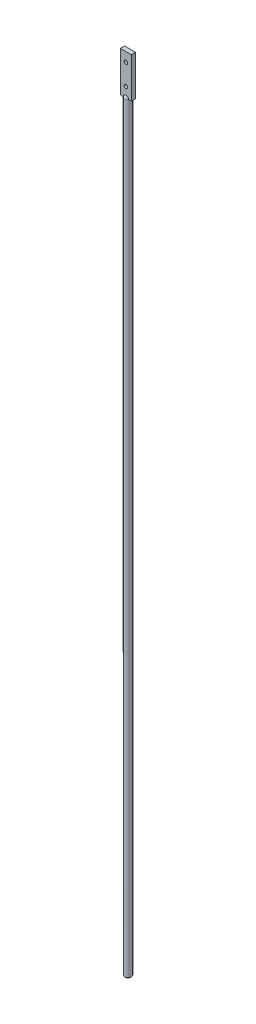
ISO-10303-21;
HEADER;
FILE_DESCRIPTION(('STEP AP214'),'2;1');
FILE_NAME('part.step','',(''),(''),'','','');
FILE_SCHEMA(('AUTOMOTIVE_DESIGN { 1 0 10303 214 1 1 1 1 }'));
ENDSEC;
DATA;
#1=APPLICATION_CONTEXT('core data for automotive mechanical design processes');
#2=APPLICATION_PROTOCOL_DEFINITION('international standard','automotive_design',2000,#1);
#3=PRODUCT_CONTEXT('',#1,'mechanical');
#4=PRODUCT('Part','Part','',(#3));
#5=PRODUCT_RELATED_PRODUCT_CATEGORY('part','',(#4));
#6=PRODUCT_DEFINITION_FORMATION('','',#4);
#7=PRODUCT_DEFINITION_CONTEXT('part definition',#1,'design');
#8=PRODUCT_DEFINITION('design','',#6,#7);
#9=PRODUCT_DEFINITION_SHAPE('','',#8);
#10=(LENGTH_UNIT() NAMED_UNIT(*) SI_UNIT(.MILLI.,.METRE.));
#11=(NAMED_UNIT(*) PLANE_ANGLE_UNIT() SI_UNIT($,.RADIAN.));
#12=(NAMED_UNIT(*) SI_UNIT($,.STERADIAN.) SOLID_ANGLE_UNIT());
#13=UNCERTAINTY_MEASURE_WITH_UNIT(LENGTH_MEASURE(1.E-05),#10,'distance_accuracy_value','');
#14=(GEOMETRIC_REPRESENTATION_CONTEXT(3) GLOBAL_UNCERTAINTY_ASSIGNED_CONTEXT((#13)) GLOBAL_UNIT_ASSIGNED_CONTEXT((#10,
#11,#12)) REPRESENTATION_CONTEXT('',''));
#15=CARTESIAN_POINT('',(0.,0.,0.));
#16=DIRECTION('',(0.,0.,1.));
#17=DIRECTION('',(1.,0.,0.));
#18=AXIS2_PLACEMENT_3D('',#15,#16,#17);
#19=CARTESIAN_POINT('',(6.5,24.,2.5));
#20=DIRECTION('',(1.,0.,0.));
#21=DIRECTION('',(0.,1.,0.));
#22=AXIS2_PLACEMENT_3D('',#19,#20,#21);
#23=PLANE('',#22);
#24=DIRECTION('',(0.,1.,0.));
#25=VECTOR('',#24,1.);
#26=CARTESIAN_POINT('',(6.5,0.,-2.5));
#27=LINE('',#26,#25);
#28=CARTESIAN_POINT('',(6.5,-24.,-2.5));
#29=VERTEX_POINT('',#28);
#30=CARTESIAN_POINT('',(6.5,24.,-2.5));
#31=VERTEX_POINT('',#30);
#32=EDGE_CURVE('E76',#29,#31,#27,.T.);
#33=ORIENTED_EDGE('',*,*,#32,.T.);
#34=DIRECTION('',(0.,0.,1.));
#35=VECTOR('',#34,1.);
#36=CARTESIAN_POINT('',(6.5,24.,2.5));
#37=LINE('',#36,#35);
#38=CARTESIAN_POINT('',(6.5,24.,2.5));
#39=VERTEX_POINT('',#38);
#40=EDGE_CURVE('E79',#39,#31,#37,.F.);
#41=ORIENTED_EDGE('',*,*,#40,.F.);
#42=DIRECTION('',(0.,1.,0.));
#43=VECTOR('',#42,1.);
#44=CARTESIAN_POINT('',(6.5,0.,2.5));
#45=LINE('',#44,#43);
#46=CARTESIAN_POINT('',(6.5,-24.,2.5));
#47=VERTEX_POINT('',#46);
#48=EDGE_CURVE('E114',#47,#39,#45,.T.);
#49=ORIENTED_EDGE('',*,*,#48,.F.);
#50=DIRECTION('',(0.,0.,1.));
#51=VECTOR('',#50,1.);
#52=CARTESIAN_POINT('',(6.5,-24.,2.5));
#53=LINE('',#52,#51);
#54=EDGE_CURVE('E81',#47,#29,#53,.F.);
#55=ORIENTED_EDGE('',*,*,#54,.T.);
#56=EDGE_LOOP('',(#33,#41,#49,#55));
#57=FACE_BOUND('',#56,.T.);
#58=ADVANCED_FACE('F16',(#57),#23,.T.);
#59=CARTESIAN_POINT('',(-6.50000000000001,24.,2.5));
#60=DIRECTION('',(0.,1.,0.));
#61=DIRECTION('',(0.,0.,1.));
#62=AXIS2_PLACEMENT_3D('',#59,#60,#61);
#63=PLANE('',#62);
#64=DIRECTION('',(1.,0.,0.));
#65=VECTOR('',#64,1.);
#66=CARTESIAN_POINT('',(0.,24.,-2.5));
#67=LINE('',#66,#65);
#68=CARTESIAN_POINT('',(-6.50000000000001,24.,-2.5));
#69=VERTEX_POINT('',#68);
#70=EDGE_CURVE('E84',#31,#69,#67,.F.);
#71=ORIENTED_EDGE('',*,*,#70,.T.);
#72=DIRECTION('',(0.,0.,1.));
#73=VECTOR('',#72,1.);
#74=CARTESIAN_POINT('',(-6.50000000000001,24.,2.5));
#75=LINE('',#74,#73);
#76=CARTESIAN_POINT('',(-6.50000000000001,24.,2.5));
#77=VERTEX_POINT('',#76);
#78=EDGE_CURVE('E111',#69,#77,#75,.T.);
#79=ORIENTED_EDGE('',*,*,#78,.T.);
#80=DIRECTION('',(1.,0.,0.));
#81=VECTOR('',#80,1.);
#82=CARTESIAN_POINT('',(0.,24.,2.5));
#83=LINE('',#82,#81);
#84=EDGE_CURVE('E91',#39,#77,#83,.F.);
#85=ORIENTED_EDGE('',*,*,#84,.F.);
#86=ORIENTED_EDGE('',*,*,#40,.T.);
#87=EDGE_LOOP('',(#71,#79,#85,#86));
#88=FACE_BOUND('',#87,.T.);
#89=ADVANCED_FACE('F88',(#88),#63,.T.);
#90=CARTESIAN_POINT('',(0.,13.,2.5));
#91=DIRECTION('',(0.,0.,1.));
#92=DIRECTION('',(1.,0.,0.));
#93=AXIS2_PLACEMENT_3D('',#90,#91,#92);
#94=CYLINDRICAL_SURFACE('',#93,2.1);
#95=CARTESIAN_POINT('',(0.,13.,2.5));
#96=DIRECTION('',(0.,0.,1.));
#97=DIRECTION('',(1.,0.,0.));
#98=AXIS2_PLACEMENT_3D('',#95,#96,#97);
#99=CIRCLE('',#98,2.1);
#100=CARTESIAN_POINT('',(2.1,13.,2.5));
#101=VERTEX_POINT('',#100);
#102=EDGE_CURVE('E20',#101,#101,#99,.F.);
#103=ORIENTED_EDGE('',*,*,#102,.F.);
#104=EDGE_LOOP('',(#103));
#105=FACE_BOUND('',#104,.T.);
#106=CARTESIAN_POINT('',(0.,13.,-2.5));
#107=DIRECTION('',(0.,0.,1.));
#108=DIRECTION('',(1.,0.,0.));
#109=AXIS2_PLACEMENT_3D('',#106,#107,#108);
#110=CIRCLE('',#109,2.1);
#111=CARTESIAN_POINT('',(2.1,13.,-2.5));
#112=VERTEX_POINT('',#111);
#113=EDGE_CURVE('E98',#112,#112,#110,.F.);
#114=ORIENTED_EDGE('',*,*,#113,.T.);
#115=EDGE_LOOP('',(#114));
#116=FACE_BOUND('',#115,.T.);
#117=ADVANCED_FACE('F226',(#105,#116),#94,.F.);
#118=CARTESIAN_POINT('',(0.,-12.,2.5));
#119=DIRECTION('',(0.,0.,1.));
#120=DIRECTION('',(1.,0.,0.));
#121=AXIS2_PLACEMENT_3D('',#118,#119,#120);
#122=CYLINDRICAL_SURFACE('',#121,2.1);
#123=CARTESIAN_POINT('',(0.,-12.,2.5));
#124=DIRECTION('',(0.,0.,1.));
#125=DIRECTION('',(1.,0.,0.));
#126=AXIS2_PLACEMENT_3D('',#123,#124,#125);
#127=CIRCLE('',#126,2.1);
#128=CARTESIAN_POINT('',(2.1,-12.,2.5));
#129=VERTEX_POINT('',#128);
#130=EDGE_CURVE('E140',#129,#129,#127,.F.);
#131=ORIENTED_EDGE('',*,*,#130,.F.);
#132=EDGE_LOOP('',(#131));
#133=FACE_BOUND('',#132,.T.);
#134=CARTESIAN_POINT('',(0.,-12.,-2.5));
#135=DIRECTION('',(0.,0.,1.));
#136=DIRECTION('',(1.,0.,0.));
#137=AXIS2_PLACEMENT_3D('',#134,#135,#136);
#138=CIRCLE('',#137,2.1);
#139=CARTESIAN_POINT('',(2.1,-12.,-2.5));
#140=VERTEX_POINT('',#139);
#141=EDGE_CURVE('E136',#140,#140,#138,.F.);
#142=ORIENTED_EDGE('',*,*,#141,.T.);
#143=EDGE_LOOP('',(#142));
#144=FACE_BOUND('',#143,.T.);
#145=ADVANCED_FACE('F222',(#133,#144),#122,.F.);
#146=CARTESIAN_POINT('',(0.,-929.5,0.));
#147=DIRECTION('',(0.,-1.,0.));
#148=DIRECTION('',(0.,0.,-1.));
#149=AXIS2_PLACEMENT_3D('',#146,#147,#148);
#150=PLANE('',#149);
#151=CARTESIAN_POINT('',(0.,-929.499999999962,0.));
#152=DIRECTION('',(0.,1.,0.));
#153=DIRECTION('',(-1.,0.,0.));
#154=AXIS2_PLACEMENT_3D('',#151,#152,#153);
#155=CIRCLE('',#154,3.00000000004275);
#156=CARTESIAN_POINT('',(-3.00000000004273,-929.499999999962,0.));
#157=VERTEX_POINT('',#156);
#158=EDGE_CURVE('E133',#157,#157,#155,.T.);
#159=ORIENTED_EDGE('',*,*,#158,.F.);
#160=EDGE_LOOP('',(#159));
#161=FACE_BOUND('',#160,.T.);
#162=ADVANCED_FACE('F219',(#161),#150,.T.);
#163=CARTESIAN_POINT('',(-6.5,-24.,2.5));
#164=DIRECTION('',(0.,1.,0.));
#165=DIRECTION('',(0.,0.,1.));
#166=AXIS2_PLACEMENT_3D('',#163,#164,#165);
#167=PLANE('',#166);
#168=DIRECTION('',(1.,0.,0.));
#169=VECTOR('',#168,1.);
#170=CARTESIAN_POINT('',(0.,-24.,-2.5));
#171=LINE('',#170,#169);
#172=CARTESIAN_POINT('',(3.1224989991992,-24.,-2.5));
#173=VERTEX_POINT('',#172);
#174=EDGE_CURVE('E85',#173,#29,#171,.T.);
#175=ORIENTED_EDGE('',*,*,#174,.T.);
#176=ORIENTED_EDGE('',*,*,#54,.F.);
#177=DIRECTION('',(1.,0.,0.));
#178=VECTOR('',#177,1.);
#179=CARTESIAN_POINT('',(0.,-24.,2.5));
#180=LINE('',#179,#178);
#181=CARTESIAN_POINT('',(3.1224989991992,-24.,2.5));
#182=VERTEX_POINT('',#181);
#183=EDGE_CURVE('E116',#182,#47,#180,.T.);
#184=ORIENTED_EDGE('',*,*,#183,.F.);
#185=CARTESIAN_POINT('',(0.,-24.,0.));
#186=DIRECTION('',(0.,1.,0.));
#187=DIRECTION('',(0.,0.,1.));
#188=AXIS2_PLACEMENT_3D('',#185,#186,#187);
#189=CIRCLE('',#188,4.);
#190=EDGE_CURVE('E131',#173,#182,#189,.F.);
#191=ORIENTED_EDGE('',*,*,#190,.F.);
#192=EDGE_LOOP('',(#175,#176,#184,#191));
#193=FACE_BOUND('',#192,.T.);
#194=ADVANCED_FACE('F190',(#193),#167,.F.);
#195=CARTESIAN_POINT('',(-6.50000000000001,24.,2.5));
#196=DIRECTION('',(1.,0.,0.));
#197=DIRECTION('',(0.,1.,0.));
#198=AXIS2_PLACEMENT_3D('',#195,#196,#197);
#199=PLANE('',#198);
#200=DIRECTION('',(0.,1.,0.));
#201=VECTOR('',#200,1.);
#202=CARTESIAN_POINT('',(-6.50000000000001,0.,2.5));
#203=LINE('',#202,#201);
#204=CARTESIAN_POINT('',(-6.5,-24.,2.5));
#205=VERTEX_POINT('',#204);
#206=EDGE_CURVE('E142',#77,#205,#203,.F.);
#207=ORIENTED_EDGE('',*,*,#206,.F.);
#208=ORIENTED_EDGE('',*,*,#78,.F.);
#209=DIRECTION('',(0.,1.,0.));
#210=VECTOR('',#209,1.);
#211=CARTESIAN_POINT('',(-6.50000000000001,0.,-2.5));
#212=LINE('',#211,#210);
#213=CARTESIAN_POINT('',(-6.5,-24.,-2.5));
#214=VERTEX_POINT('',#213);
#215=EDGE_CURVE('E96',#69,#214,#212,.F.);
#216=ORIENTED_EDGE('',*,*,#215,.T.);
#217=DIRECTION('',(0.,0.,1.));
#218=VECTOR('',#217,1.);
#219=CARTESIAN_POINT('',(-6.5,-24.,2.5));
#220=LINE('',#219,#218);
#221=EDGE_CURVE('E56',#214,#205,#220,.T.);
#222=ORIENTED_EDGE('',*,*,#221,.T.);
#223=EDGE_LOOP('',(#207,#208,#216,#222));
#224=FACE_BOUND('',#223,.T.);
#225=ADVANCED_FACE('F214',(#224),#199,.F.);
#226=CARTESIAN_POINT('',(0.,0.,2.5));
#227=DIRECTION('',(0.,0.,1.));
#228=DIRECTION('',(1.,0.,0.));
#229=AXIS2_PLACEMENT_3D('',#226,#227,#228);
#230=PLANE('',#229);
#231=ORIENTED_EDGE('',*,*,#48,.T.);
#232=ORIENTED_EDGE('',*,*,#84,.T.);
#233=ORIENTED_EDGE('',*,*,#206,.T.);
#234=DIRECTION('',(1.,0.,0.));
#235=VECTOR('',#234,1.);
#236=CARTESIAN_POINT('',(-6.5,-24.,2.5));
#237=LINE('',#236,#235);
#238=CARTESIAN_POINT('',(-3.1224989991992,-24.,2.5));
#239=VERTEX_POINT('',#238);
#240=EDGE_CURVE('E126',#205,#239,#237,.T.);
#241=ORIENTED_EDGE('',*,*,#240,.T.);
#242=CARTESIAN_POINT('',(0.,-24.,2.5));
#243=DIRECTION('',(0.,0.,1.));
#244=DIRECTION('',(1.,0.,0.));
#245=AXIS2_PLACEMENT_3D('',#242,#243,#244);
#246=CIRCLE('',#245,3.1224989991992);
#247=EDGE_CURVE('E127',#182,#239,#246,.T.);
#248=ORIENTED_EDGE('',*,*,#247,.F.);
#249=ORIENTED_EDGE('',*,*,#183,.T.);
#250=EDGE_LOOP('',(#231,#232,#233,#241,#248,#249));
#251=FACE_BOUND('',#250,.T.);
#252=ORIENTED_EDGE('',*,*,#130,.T.);
#253=EDGE_LOOP('',(#252));
#254=FACE_BOUND('',#253,.T.);
#255=ORIENTED_EDGE('',*,*,#102,.T.);
#256=EDGE_LOOP('',(#255));
#257=FACE_BOUND('',#256,.T.);
#258=ADVANCED_FACE('F180',(#251,#254,#257),#230,.T.);
#259=CARTESIAN_POINT('',(0.,0.,-2.5));
#260=DIRECTION('',(0.,0.,1.));
#261=DIRECTION('',(1.,0.,0.));
#262=AXIS2_PLACEMENT_3D('',#259,#260,#261);
#263=PLANE('',#262);
#264=ORIENTED_EDGE('',*,*,#141,.F.);
#265=EDGE_LOOP('',(#264));
#266=FACE_BOUND('',#265,.T.);
#267=ORIENTED_EDGE('',*,*,#113,.F.);
#268=EDGE_LOOP('',(#267));
#269=FACE_BOUND('',#268,.T.);
#270=DIRECTION('',(1.,0.,0.));
#271=VECTOR('',#270,1.);
#272=CARTESIAN_POINT('',(-6.5,-24.,-2.5));
#273=LINE('',#272,#271);
#274=CARTESIAN_POINT('',(-3.1224989991992,-24.,-2.5));
#275=VERTEX_POINT('',#274);
#276=EDGE_CURVE('E130',#275,#214,#273,.F.);
#277=ORIENTED_EDGE('',*,*,#276,.T.);
#278=ORIENTED_EDGE('',*,*,#215,.F.);
#279=ORIENTED_EDGE('',*,*,#70,.F.);
#280=ORIENTED_EDGE('',*,*,#32,.F.);
#281=ORIENTED_EDGE('',*,*,#174,.F.);
#282=CARTESIAN_POINT('',(0.,-24.,-2.5));
#283=DIRECTION('',(0.,0.,1.));
#284=DIRECTION('',(1.,0.,0.));
#285=AXIS2_PLACEMENT_3D('',#282,#283,#284);
#286=CIRCLE('',#285,3.1224989991992);
#287=EDGE_CURVE('E35',#275,#173,#286,.F.);
#288=ORIENTED_EDGE('',*,*,#287,.F.);
#289=EDGE_LOOP('',(#277,#278,#279,#280,#281,#288));
#290=FACE_BOUND('',#289,.T.);
#291=ADVANCED_FACE('F95',(#266,#269,#290),#263,.F.);
#292=CARTESIAN_POINT('',(0.,-928.500000000156,0.));
#293=DIRECTION('',(0.,1.,0.));
#294=DIRECTION('',(-1.,0.,0.));
#295=AXIS2_PLACEMENT_3D('',#292,#293,#294);
#296=CONICAL_SURFACE('',#295,3.99999999984857,0.785398163397448);
#297=ORIENTED_EDGE('',*,*,#158,.T.);
#298=EDGE_LOOP('',(#297));
#299=FACE_BOUND('',#298,.T.);
#300=CARTESIAN_POINT('',(0.,-928.5,0.));
#301=DIRECTION('',(0.,1.,0.));
#302=DIRECTION('',(0.,0.,1.));
#303=AXIS2_PLACEMENT_3D('',#300,#301,#302);
#304=CIRCLE('',#303,4.);
#305=CARTESIAN_POINT('',(0.,-928.5,4.));
#306=VERTEX_POINT('',#305);
#307=EDGE_CURVE('E125',#306,#306,#304,.T.);
#308=ORIENTED_EDGE('',*,*,#307,.F.);
#309=EDGE_LOOP('',(#308));
#310=FACE_BOUND('',#309,.T.);
#311=ADVANCED_FACE('F204',(#299,#310),#296,.T.);
#312=CARTESIAN_POINT('',(0.,-24.,0.));
#313=DIRECTION('',(1.,0.,0.));
#314=DIRECTION('',(0.,0.785891834052638,0.618363990841463));
#315=AXIS2_PLACEMENT_3D('',#312,#313,#314);
#316=SPHERICAL_SURFACE('',#315,4.);
#317=CARTESIAN_POINT('',(0.,-24.,0.));
#318=DIRECTION('',(0.,1.,0.));
#319=DIRECTION('',(0.,0.,1.));
#320=AXIS2_PLACEMENT_3D('',#317,#318,#319);
#321=CIRCLE('',#320,4.);
#322=EDGE_CURVE('E123',#182,#239,#321,.F.);
#323=ORIENTED_EDGE('',*,*,#322,.F.);
#324=ORIENTED_EDGE('',*,*,#247,.T.);
#325=EDGE_LOOP('',(#323,#324));
#326=FACE_BOUND('',#325,.T.);
#327=ADVANCED_FACE('F185',(#326),#316,.T.);
#328=CARTESIAN_POINT('',(-6.5,-24.,2.5));
#329=DIRECTION('',(0.,1.,0.));
#330=DIRECTION('',(0.,0.,1.));
#331=AXIS2_PLACEMENT_3D('',#328,#329,#330);
#332=PLANE('',#331);
#333=ORIENTED_EDGE('',*,*,#240,.F.);
#334=ORIENTED_EDGE('',*,*,#221,.F.);
#335=ORIENTED_EDGE('',*,*,#276,.F.);
#336=CARTESIAN_POINT('',(0.,-24.,0.));
#337=DIRECTION('',(0.,1.,0.));
#338=DIRECTION('',(0.,0.,1.));
#339=AXIS2_PLACEMENT_3D('',#336,#337,#338);
#340=CIRCLE('',#339,4.);
#341=EDGE_CURVE('E26',#239,#275,#340,.F.);
#342=ORIENTED_EDGE('',*,*,#341,.F.);
#343=EDGE_LOOP('',(#333,#334,#335,#342));
#344=FACE_BOUND('',#343,.T.);
#345=ADVANCED_FACE('F187',(#344),#332,.F.);
#346=CARTESIAN_POINT('',(0.,-24.,0.));
#347=DIRECTION('',(1.,0.,0.));
#348=DIRECTION('',(0.,0.,-1.));
#349=AXIS2_PLACEMENT_3D('',#346,#347,#348);
#350=SPHERICAL_SURFACE('',#349,4.);
#351=ORIENTED_EDGE('',*,*,#287,.T.);
#352=CARTESIAN_POINT('',(0.,-24.,0.));
#353=DIRECTION('',(0.,1.,0.));
#354=DIRECTION('',(0.,0.,1.));
#355=AXIS2_PLACEMENT_3D('',#352,#353,#354);
#356=CIRCLE('',#355,4.);
#357=EDGE_CURVE('E11',#275,#173,#356,.F.);
#358=ORIENTED_EDGE('',*,*,#357,.F.);
#359=EDGE_LOOP('',(#351,#358));
#360=FACE_BOUND('',#359,.T.);
#361=ADVANCED_FACE('F18',(#360),#350,.T.);
#362=CARTESIAN_POINT('',(0.,-929.5,0.));
#363=DIRECTION('',(0.,1.,0.));
#364=DIRECTION('',(0.,0.,1.));
#365=AXIS2_PLACEMENT_3D('',#362,#363,#364);
#366=CYLINDRICAL_SURFACE('',#365,4.);
#367=ORIENTED_EDGE('',*,*,#307,.T.);
#368=EDGE_LOOP('',(#367));
#369=FACE_BOUND('',#368,.T.);
#370=ORIENTED_EDGE('',*,*,#341,.T.);
#371=ORIENTED_EDGE('',*,*,#357,.T.);
#372=ORIENTED_EDGE('',*,*,#190,.T.);
#373=ORIENTED_EDGE('',*,*,#322,.T.);
#374=EDGE_LOOP('',(#370,#371,#372,#373));
#375=FACE_BOUND('',#374,.T.);
#376=ADVANCED_FACE('F188',(#369,#375),#366,.T.);
#377=CLOSED_SHELL('',(#58,#89,#117,#145,#162,#194,#225,#258,#291,#311,#327,#345,#361,#376));
#378=MANIFOLD_SOLID_BREP('B1',#377);
#379=ADVANCED_BREP_SHAPE_REPRESENTATION('',(#18,#378),#14);
#380=SHAPE_DEFINITION_REPRESENTATION(#9,#379);
ENDSEC;
END-ISO-10303-21;
